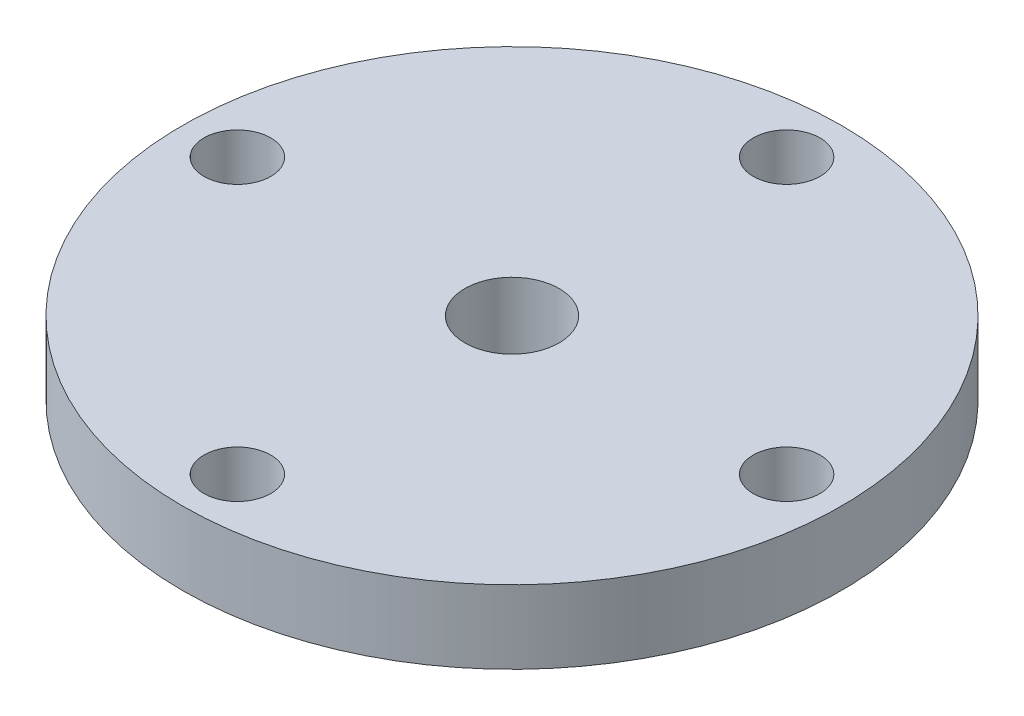
ISO-10303-21;
HEADER;
FILE_DESCRIPTION(('STEP AP214'),'2;1');
FILE_NAME('part.step','',(''),(''),'','','');
FILE_SCHEMA(('AUTOMOTIVE_DESIGN { 1 0 10303 214 1 1 1 1 }'));
ENDSEC;
DATA;
#1=APPLICATION_CONTEXT('core data for automotive mechanical design processes');
#2=APPLICATION_PROTOCOL_DEFINITION('international standard','automotive_design',2000,#1);
#3=PRODUCT_CONTEXT('',#1,'mechanical');
#4=PRODUCT('Part','Part','',(#3));
#5=PRODUCT_RELATED_PRODUCT_CATEGORY('part','',(#4));
#6=PRODUCT_DEFINITION_FORMATION('','',#4);
#7=PRODUCT_DEFINITION_CONTEXT('part definition',#1,'design');
#8=PRODUCT_DEFINITION('design','',#6,#7);
#9=PRODUCT_DEFINITION_SHAPE('','',#8);
#10=(LENGTH_UNIT() NAMED_UNIT(*) SI_UNIT(.MILLI.,.METRE.));
#11=(NAMED_UNIT(*) PLANE_ANGLE_UNIT() SI_UNIT($,.RADIAN.));
#12=(NAMED_UNIT(*) SI_UNIT($,.STERADIAN.) SOLID_ANGLE_UNIT());
#13=UNCERTAINTY_MEASURE_WITH_UNIT(LENGTH_MEASURE(1.E-05),#10,'distance_accuracy_value','');
#14=(GEOMETRIC_REPRESENTATION_CONTEXT(3) GLOBAL_UNCERTAINTY_ASSIGNED_CONTEXT((#13)) GLOBAL_UNIT_ASSIGNED_CONTEXT((#10,
#11,#12)) REPRESENTATION_CONTEXT('',''));
#15=CARTESIAN_POINT('',(0.,0.,0.));
#16=DIRECTION('',(0.,0.,1.));
#17=DIRECTION('',(1.,0.,0.));
#18=AXIS2_PLACEMENT_3D('',#15,#16,#17);
#19=CARTESIAN_POINT('',(0.,4.,0.));
#20=DIRECTION('',(0.,-1.,0.));
#21=DIRECTION('',(0.,0.,-1.));
#22=AXIS2_PLACEMENT_3D('',#19,#20,#21);
#23=CYLINDRICAL_SURFACE('',#22,18.);
#24=CARTESIAN_POINT('',(0.,4.,0.));
#25=DIRECTION('',(0.,1.,0.));
#26=DIRECTION('',(0.,0.,1.));
#27=AXIS2_PLACEMENT_3D('',#24,#25,#26);
#28=CIRCLE('',#27,18.);
#29=CARTESIAN_POINT('',(0.,4.,18.));
#30=VERTEX_POINT('',#29);
#31=EDGE_CURVE('E10',#30,#30,#28,.T.);
#32=ORIENTED_EDGE('',*,*,#31,.F.);
#33=EDGE_LOOP('',(#32));
#34=FACE_BOUND('',#33,.T.);
#35=CARTESIAN_POINT('',(0.,0.,0.));
#36=DIRECTION('',(0.,1.,0.));
#37=DIRECTION('',(0.,0.,1.));
#38=AXIS2_PLACEMENT_3D('',#35,#36,#37);
#39=CIRCLE('',#38,18.);
#40=CARTESIAN_POINT('',(0.,0.,18.));
#41=VERTEX_POINT('',#40);
#42=EDGE_CURVE('E34',#41,#41,#39,.T.);
#43=ORIENTED_EDGE('',*,*,#42,.T.);
#44=EDGE_LOOP('',(#43));
#45=FACE_BOUND('',#44,.T.);
#46=ADVANCED_FACE('F31',(#34,#45),#23,.T.);
#47=CARTESIAN_POINT('',(0.,4.,0.));
#48=DIRECTION('',(0.,1.,0.));
#49=DIRECTION('',(0.,0.,1.));
#50=AXIS2_PLACEMENT_3D('',#47,#48,#49);
#51=PLANE('',#50);
#52=CARTESIAN_POINT('',(0.,4.,-15.));
#53=DIRECTION('',(0.,1.,0.));
#54=DIRECTION('',(0.,0.,1.));
#55=AXIS2_PLACEMENT_3D('',#52,#53,#54);
#56=CIRCLE('',#55,1.825);
#57=CARTESIAN_POINT('',(0.,4.,-13.175));
#58=VERTEX_POINT('',#57);
#59=EDGE_CURVE('E56',#58,#58,#56,.T.);
#60=ORIENTED_EDGE('',*,*,#59,.F.);
#61=EDGE_LOOP('',(#60));
#62=FACE_BOUND('',#61,.T.);
#63=CARTESIAN_POINT('',(-14.9999999999996,4.,4.26631803155847E-13));
#64=DIRECTION('',(0.,1.,0.));
#65=DIRECTION('',(0.,0.,1.));
#66=AXIS2_PLACEMENT_3D('',#63,#64,#65);
#67=CIRCLE('',#66,1.825);
#68=CARTESIAN_POINT('',(-14.9999999999996,4.,1.82500000000043));
#69=VERTEX_POINT('',#68);
#70=EDGE_CURVE('E57',#69,#69,#67,.T.);
#71=ORIENTED_EDGE('',*,*,#70,.F.);
#72=EDGE_LOOP('',(#71));
#73=FACE_BOUND('',#72,.T.);
#74=CARTESIAN_POINT('',(8.49589665914252E-13,4.,15.));
#75=DIRECTION('',(0.,1.,0.));
#76=DIRECTION('',(0.,0.,1.));
#77=AXIS2_PLACEMENT_3D('',#74,#75,#76);
#78=CIRCLE('',#77,1.825);
#79=CARTESIAN_POINT('',(8.49589665914252E-13,4.,16.825));
#80=VERTEX_POINT('',#79);
#81=EDGE_CURVE('E63',#80,#80,#78,.T.);
#82=ORIENTED_EDGE('',*,*,#81,.F.);
#83=EDGE_LOOP('',(#82));
#84=FACE_BOUND('',#83,.T.);
#85=CARTESIAN_POINT('',(15.0000000000004,4.,-4.24794832957126E-13));
#86=DIRECTION('',(0.,1.,0.));
#87=DIRECTION('',(0.,0.,1.));
#88=AXIS2_PLACEMENT_3D('',#85,#86,#87);
#89=CIRCLE('',#88,1.825);
#90=CARTESIAN_POINT('',(15.0000000000004,4.,1.82499999999958));
#91=VERTEX_POINT('',#90);
#92=EDGE_CURVE('E43',#91,#91,#89,.T.);
#93=ORIENTED_EDGE('',*,*,#92,.F.);
#94=EDGE_LOOP('',(#93));
#95=FACE_BOUND('',#94,.T.);
#96=CARTESIAN_POINT('',(0.,4.,0.));
#97=DIRECTION('',(0.,1.,0.));
#98=DIRECTION('',(0.,0.,1.));
#99=AXIS2_PLACEMENT_3D('',#96,#97,#98);
#100=CIRCLE('',#99,2.575);
#101=CARTESIAN_POINT('',(0.,4.,2.575));
#102=VERTEX_POINT('',#101);
#103=EDGE_CURVE('E50',#102,#102,#100,.T.);
#104=ORIENTED_EDGE('',*,*,#103,.F.);
#105=EDGE_LOOP('',(#104));
#106=FACE_BOUND('',#105,.T.);
#107=ORIENTED_EDGE('',*,*,#31,.T.);
#108=EDGE_LOOP('',(#107));
#109=FACE_BOUND('',#108,.T.);
#110=ADVANCED_FACE('F83',(#62,#73,#84,#95,#106,#109),#51,.T.);
#111=CARTESIAN_POINT('',(0.,0.,0.));
#112=DIRECTION('',(0.,1.,0.));
#113=DIRECTION('',(0.,0.,1.));
#114=AXIS2_PLACEMENT_3D('',#111,#112,#113);
#115=PLANE('',#114);
#116=CARTESIAN_POINT('',(0.,0.,-15.));
#117=DIRECTION('',(0.,1.,0.));
#118=DIRECTION('',(0.,0.,1.));
#119=AXIS2_PLACEMENT_3D('',#116,#117,#118);
#120=CIRCLE('',#119,1.825);
#121=CARTESIAN_POINT('',(0.,0.,-13.175));
#122=VERTEX_POINT('',#121);
#123=EDGE_CURVE('E41',#122,#122,#120,.T.);
#124=ORIENTED_EDGE('',*,*,#123,.T.);
#125=EDGE_LOOP('',(#124));
#126=FACE_BOUND('',#125,.T.);
#127=CARTESIAN_POINT('',(-14.9999999999996,0.,4.26631803155847E-13));
#128=DIRECTION('',(0.,1.,0.));
#129=DIRECTION('',(0.,0.,1.));
#130=AXIS2_PLACEMENT_3D('',#127,#128,#129);
#131=CIRCLE('',#130,1.825);
#132=CARTESIAN_POINT('',(-14.9999999999996,0.,1.82500000000043));
#133=VERTEX_POINT('',#132);
#134=EDGE_CURVE('E60',#133,#133,#131,.T.);
#135=ORIENTED_EDGE('',*,*,#134,.T.);
#136=EDGE_LOOP('',(#135));
#137=FACE_BOUND('',#136,.T.);
#138=CARTESIAN_POINT('',(8.49589665914252E-13,0.,15.));
#139=DIRECTION('',(0.,1.,0.));
#140=DIRECTION('',(0.,0.,1.));
#141=AXIS2_PLACEMENT_3D('',#138,#139,#140);
#142=CIRCLE('',#141,1.825);
#143=CARTESIAN_POINT('',(8.49589665914252E-13,0.,16.825));
#144=VERTEX_POINT('',#143);
#145=EDGE_CURVE('E47',#144,#144,#142,.T.);
#146=ORIENTED_EDGE('',*,*,#145,.T.);
#147=EDGE_LOOP('',(#146));
#148=FACE_BOUND('',#147,.T.);
#149=CARTESIAN_POINT('',(15.0000000000004,0.,-4.24794832957126E-13));
#150=DIRECTION('',(0.,1.,0.));
#151=DIRECTION('',(0.,0.,1.));
#152=AXIS2_PLACEMENT_3D('',#149,#150,#151);
#153=CIRCLE('',#152,1.825);
#154=CARTESIAN_POINT('',(15.0000000000004,0.,1.82499999999958));
#155=VERTEX_POINT('',#154);
#156=EDGE_CURVE('E46',#155,#155,#153,.T.);
#157=ORIENTED_EDGE('',*,*,#156,.T.);
#158=EDGE_LOOP('',(#157));
#159=FACE_BOUND('',#158,.T.);
#160=CARTESIAN_POINT('',(0.,0.,0.));
#161=DIRECTION('',(0.,1.,0.));
#162=DIRECTION('',(0.,0.,1.));
#163=AXIS2_PLACEMENT_3D('',#160,#161,#162);
#164=CIRCLE('',#163,2.575);
#165=CARTESIAN_POINT('',(0.,0.,2.575));
#166=VERTEX_POINT('',#165);
#167=EDGE_CURVE('E53',#166,#166,#164,.T.);
#168=ORIENTED_EDGE('',*,*,#167,.T.);
#169=EDGE_LOOP('',(#168));
#170=FACE_BOUND('',#169,.T.);
#171=ORIENTED_EDGE('',*,*,#42,.F.);
#172=EDGE_LOOP('',(#171));
#173=FACE_BOUND('',#172,.T.);
#174=ADVANCED_FACE('F73',(#126,#137,#148,#159,#170,#173),#115,.F.);
#175=CARTESIAN_POINT('',(0.,0.,0.));
#176=DIRECTION('',(0.,1.,0.));
#177=DIRECTION('',(0.,0.,1.));
#178=AXIS2_PLACEMENT_3D('',#175,#176,#177);
#179=CYLINDRICAL_SURFACE('',#178,2.575);
#180=ORIENTED_EDGE('',*,*,#167,.F.);
#181=EDGE_LOOP('',(#180));
#182=FACE_BOUND('',#181,.T.);
#183=ORIENTED_EDGE('',*,*,#103,.T.);
#184=EDGE_LOOP('',(#183));
#185=FACE_BOUND('',#184,.T.);
#186=ADVANCED_FACE('F95',(#182,#185),#179,.F.);
#187=CARTESIAN_POINT('',(15.0000000000004,0.,-4.24794832957126E-13));
#188=DIRECTION('',(0.,1.,0.));
#189=DIRECTION('',(0.,0.,1.));
#190=AXIS2_PLACEMENT_3D('',#187,#188,#189);
#191=CYLINDRICAL_SURFACE('',#190,1.825);
#192=ORIENTED_EDGE('',*,*,#156,.F.);
#193=EDGE_LOOP('',(#192));
#194=FACE_BOUND('',#193,.T.);
#195=ORIENTED_EDGE('',*,*,#92,.T.);
#196=EDGE_LOOP('',(#195));
#197=FACE_BOUND('',#196,.T.);
#198=ADVANCED_FACE('F97',(#194,#197),#191,.F.);
#199=CARTESIAN_POINT('',(8.49589665914252E-13,0.,15.));
#200=DIRECTION('',(0.,1.,0.));
#201=DIRECTION('',(0.,0.,1.));
#202=AXIS2_PLACEMENT_3D('',#199,#200,#201);
#203=CYLINDRICAL_SURFACE('',#202,1.825);
#204=ORIENTED_EDGE('',*,*,#145,.F.);
#205=EDGE_LOOP('',(#204));
#206=FACE_BOUND('',#205,.T.);
#207=ORIENTED_EDGE('',*,*,#81,.T.);
#208=EDGE_LOOP('',(#207));
#209=FACE_BOUND('',#208,.T.);
#210=ADVANCED_FACE('F104',(#206,#209),#203,.F.);
#211=CARTESIAN_POINT('',(-14.9999999999996,0.,4.26631803155847E-13));
#212=DIRECTION('',(0.,1.,0.));
#213=DIRECTION('',(0.,0.,1.));
#214=AXIS2_PLACEMENT_3D('',#211,#212,#213);
#215=CYLINDRICAL_SURFACE('',#214,1.825);
#216=ORIENTED_EDGE('',*,*,#134,.F.);
#217=EDGE_LOOP('',(#216));
#218=FACE_BOUND('',#217,.T.);
#219=ORIENTED_EDGE('',*,*,#70,.T.);
#220=EDGE_LOOP('',(#219));
#221=FACE_BOUND('',#220,.T.);
#222=ADVANCED_FACE('F79',(#218,#221),#215,.F.);
#223=CARTESIAN_POINT('',(0.,0.,-15.));
#224=DIRECTION('',(0.,1.,0.));
#225=DIRECTION('',(0.,0.,1.));
#226=AXIS2_PLACEMENT_3D('',#223,#224,#225);
#227=CYLINDRICAL_SURFACE('',#226,1.825);
#228=ORIENTED_EDGE('',*,*,#123,.F.);
#229=EDGE_LOOP('',(#228));
#230=FACE_BOUND('',#229,.T.);
#231=ORIENTED_EDGE('',*,*,#59,.T.);
#232=EDGE_LOOP('',(#231));
#233=FACE_BOUND('',#232,.T.);
#234=ADVANCED_FACE('F76',(#230,#233),#227,.F.);
#235=CLOSED_SHELL('',(#46,#110,#174,#186,#198,#210,#222,#234));
#236=MANIFOLD_SOLID_BREP('B2',#235);
#237=ADVANCED_BREP_SHAPE_REPRESENTATION('',(#18,#236),#14);
#238=SHAPE_DEFINITION_REPRESENTATION(#9,#237);
ENDSEC;
END-ISO-10303-21;
